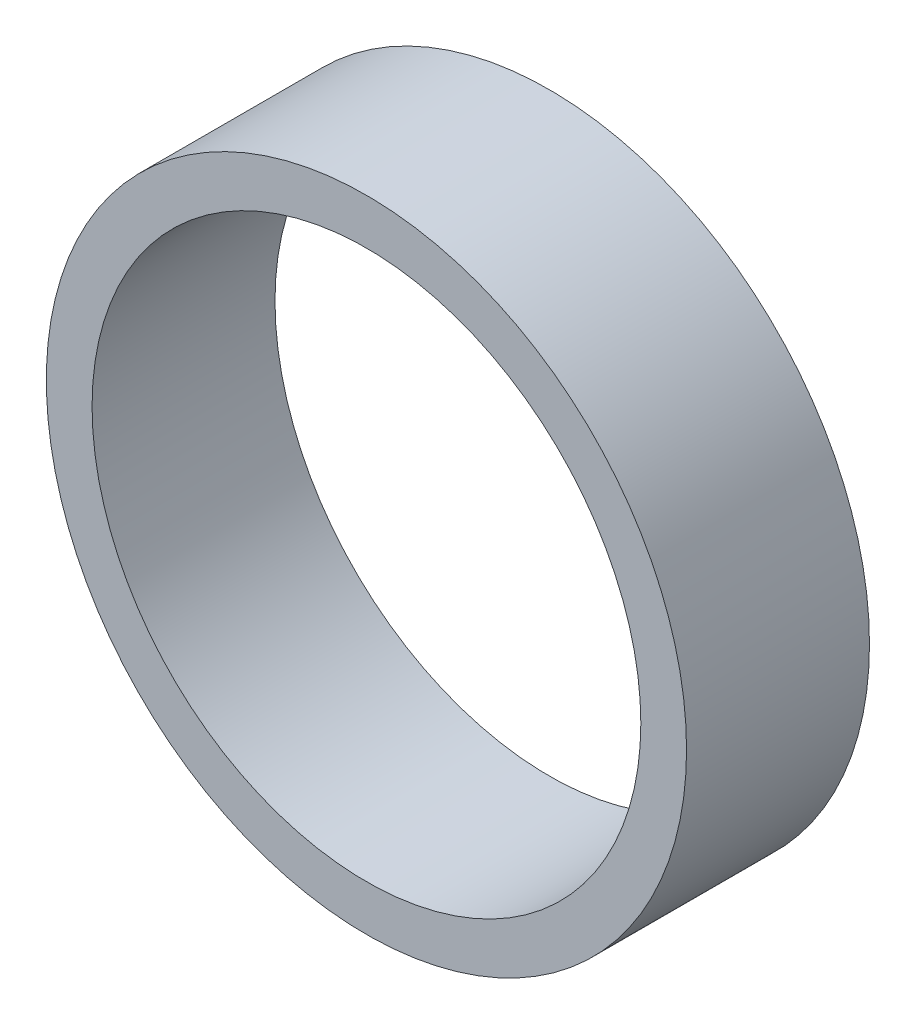
ISO-10303-21;
HEADER;
FILE_DESCRIPTION(('STEP AP214'),'2;1');
FILE_NAME('part.step','',(''),(''),'','','');
FILE_SCHEMA(('AUTOMOTIVE_DESIGN { 1 0 10303 214 1 1 1 1 }'));
ENDSEC;
DATA;
#1=APPLICATION_CONTEXT('core data for automotive mechanical design processes');
#2=APPLICATION_PROTOCOL_DEFINITION('international standard','automotive_design',2000,#1);
#3=PRODUCT_CONTEXT('',#1,'mechanical');
#4=PRODUCT('Part','Part','',(#3));
#5=PRODUCT_RELATED_PRODUCT_CATEGORY('part','',(#4));
#6=PRODUCT_DEFINITION_FORMATION('','',#4);
#7=PRODUCT_DEFINITION_CONTEXT('part definition',#1,'design');
#8=PRODUCT_DEFINITION('design','',#6,#7);
#9=PRODUCT_DEFINITION_SHAPE('','',#8);
#10=(LENGTH_UNIT() NAMED_UNIT(*) SI_UNIT(.MILLI.,.METRE.));
#11=(NAMED_UNIT(*) PLANE_ANGLE_UNIT() SI_UNIT($,.RADIAN.));
#12=(NAMED_UNIT(*) SI_UNIT($,.STERADIAN.) SOLID_ANGLE_UNIT());
#13=UNCERTAINTY_MEASURE_WITH_UNIT(LENGTH_MEASURE(1.E-05),#10,'distance_accuracy_value','');
#14=(GEOMETRIC_REPRESENTATION_CONTEXT(3) GLOBAL_UNCERTAINTY_ASSIGNED_CONTEXT((#13)) GLOBAL_UNIT_ASSIGNED_CONTEXT((#10,
#11,#12)) REPRESENTATION_CONTEXT('',''));
#15=CARTESIAN_POINT('',(0.,0.,0.));
#16=DIRECTION('',(0.,0.,1.));
#17=DIRECTION('',(1.,0.,0.));
#18=AXIS2_PLACEMENT_3D('',#15,#16,#17);
#19=CARTESIAN_POINT('',(0.,0.,150.));
#20=DIRECTION('',(0.,0.,1.));
#21=DIRECTION('',(1.,0.,0.));
#22=AXIS2_PLACEMENT_3D('',#19,#20,#21);
#23=CYLINDRICAL_SURFACE('',#22,15.);
#24=CARTESIAN_POINT('',(0.,0.,-61.));
#25=DIRECTION('',(0.,0.,1.));
#26=DIRECTION('',(1.,0.,0.));
#27=AXIS2_PLACEMENT_3D('',#24,#25,#26);
#28=CIRCLE('',#27,15.);
#29=CARTESIAN_POINT('',(15.,0.,-61.));
#30=VERTEX_POINT('',#29);
#31=EDGE_CURVE('E10',#30,#30,#28,.T.);
#32=ORIENTED_EDGE('',*,*,#31,.T.);
#33=EDGE_LOOP('',(#32));
#34=FACE_BOUND('',#33,.T.);
#35=CARTESIAN_POINT('',(0.,0.,-71.));
#36=DIRECTION('',(0.,0.,1.));
#37=DIRECTION('',(1.,0.,0.));
#38=AXIS2_PLACEMENT_3D('',#35,#36,#37);
#39=CIRCLE('',#38,15.);
#40=CARTESIAN_POINT('',(15.,0.,-71.));
#41=VERTEX_POINT('',#40);
#42=EDGE_CURVE('E53',#41,#41,#39,.T.);
#43=ORIENTED_EDGE('',*,*,#42,.F.);
#44=EDGE_LOOP('',(#43));
#45=FACE_BOUND('',#44,.T.);
#46=ADVANCED_FACE('F34',(#34,#45),#23,.F.);
#47=CARTESIAN_POINT('',(15.,0.,-61.));
#48=DIRECTION('',(0.,0.,1.));
#49=DIRECTION('',(1.,0.,0.));
#50=AXIS2_PLACEMENT_3D('',#47,#48,#49);
#51=PLANE('',#50);
#52=CARTESIAN_POINT('',(0.,0.,-61.));
#53=DIRECTION('',(0.,0.,1.));
#54=DIRECTION('',(1.,0.,0.));
#55=AXIS2_PLACEMENT_3D('',#52,#53,#54);
#56=CIRCLE('',#55,17.5);
#57=CARTESIAN_POINT('',(17.5,0.,-61.));
#58=VERTEX_POINT('',#57);
#59=EDGE_CURVE('E45',#58,#58,#56,.T.);
#60=ORIENTED_EDGE('',*,*,#59,.T.);
#61=EDGE_LOOP('',(#60));
#62=FACE_BOUND('',#61,.T.);
#63=ORIENTED_EDGE('',*,*,#31,.F.);
#64=EDGE_LOOP('',(#63));
#65=FACE_BOUND('',#64,.T.);
#66=ADVANCED_FACE('F66',(#62,#65),#51,.T.);
#67=CARTESIAN_POINT('',(0.,0.,150.));
#68=DIRECTION('',(0.,0.,1.));
#69=DIRECTION('',(1.,0.,0.));
#70=AXIS2_PLACEMENT_3D('',#67,#68,#69);
#71=CYLINDRICAL_SURFACE('',#70,17.5);
#72=CARTESIAN_POINT('',(0.,0.,-71.));
#73=DIRECTION('',(0.,0.,1.));
#74=DIRECTION('',(1.,0.,0.));
#75=AXIS2_PLACEMENT_3D('',#72,#73,#74);
#76=CIRCLE('',#75,17.5);
#77=CARTESIAN_POINT('',(17.5,0.,-71.));
#78=VERTEX_POINT('',#77);
#79=EDGE_CURVE('E48',#78,#78,#76,.T.);
#80=ORIENTED_EDGE('',*,*,#79,.T.);
#81=EDGE_LOOP('',(#80));
#82=FACE_BOUND('',#81,.T.);
#83=ORIENTED_EDGE('',*,*,#59,.F.);
#84=EDGE_LOOP('',(#83));
#85=FACE_BOUND('',#84,.T.);
#86=ADVANCED_FACE('F72',(#82,#85),#71,.T.);
#87=CARTESIAN_POINT('',(17.5,0.,-71.));
#88=DIRECTION('',(0.,0.,-1.));
#89=DIRECTION('',(-1.,0.,0.));
#90=AXIS2_PLACEMENT_3D('',#87,#88,#89);
#91=PLANE('',#90);
#92=ORIENTED_EDGE('',*,*,#42,.T.);
#93=EDGE_LOOP('',(#92));
#94=FACE_BOUND('',#93,.T.);
#95=ORIENTED_EDGE('',*,*,#79,.F.);
#96=EDGE_LOOP('',(#95));
#97=FACE_BOUND('',#96,.T.);
#98=ADVANCED_FACE('F61',(#94,#97),#91,.T.);
#99=CLOSED_SHELL('',(#46,#66,#86,#98));
#100=MANIFOLD_SOLID_BREP('B2',#99);
#101=ADVANCED_BREP_SHAPE_REPRESENTATION('',(#18,#100),#14);
#102=SHAPE_DEFINITION_REPRESENTATION(#9,#101);
ENDSEC;
END-ISO-10303-21;
